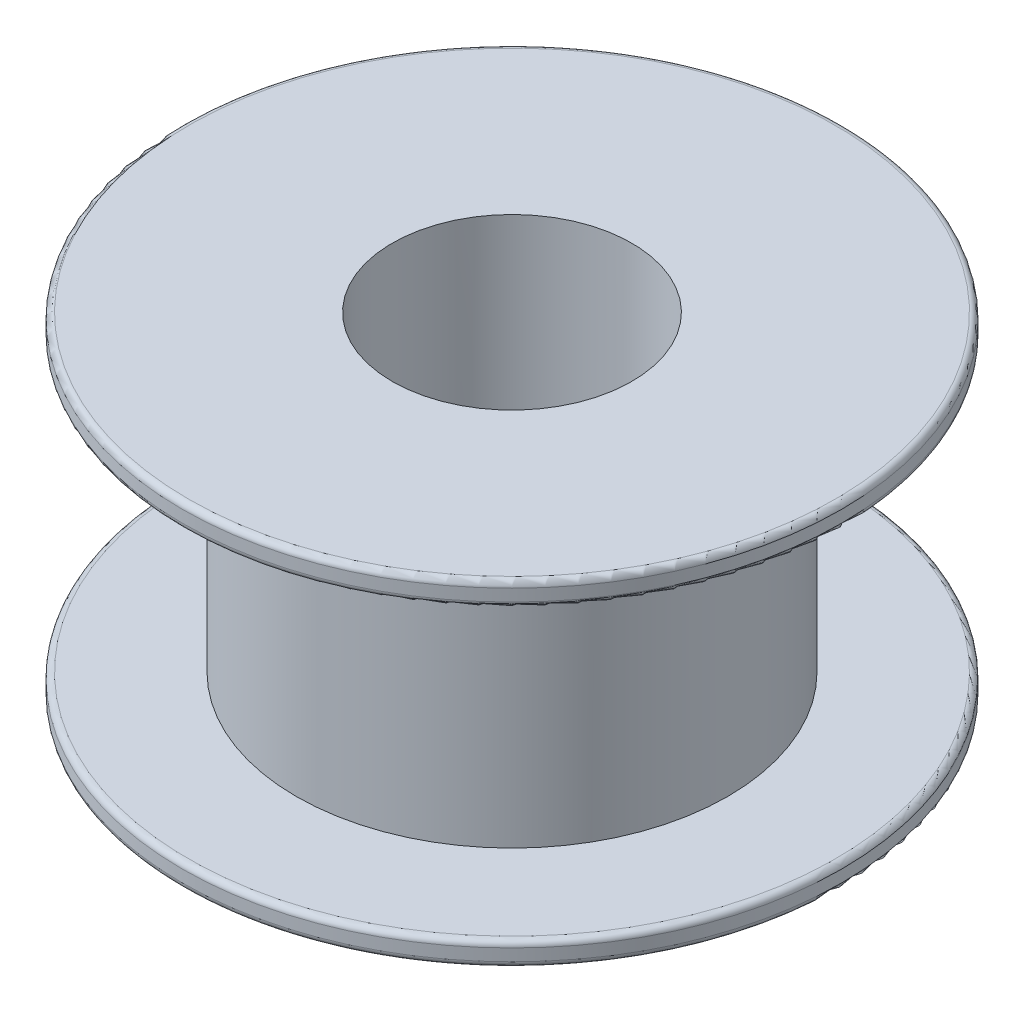
ISO-10303-21;
HEADER;
FILE_DESCRIPTION(('STEP AP214'),'2;1');
FILE_NAME('part.step','',(''),(''),'','','');
FILE_SCHEMA(('AUTOMOTIVE_DESIGN { 1 0 10303 214 1 1 1 1 }'));
ENDSEC;
DATA;
#1=APPLICATION_CONTEXT('core data for automotive mechanical design processes');
#2=APPLICATION_PROTOCOL_DEFINITION('international standard','automotive_design',2000,#1);
#3=PRODUCT_CONTEXT('',#1,'mechanical');
#4=PRODUCT('Part','Part','',(#3));
#5=PRODUCT_RELATED_PRODUCT_CATEGORY('part','',(#4));
#6=PRODUCT_DEFINITION_FORMATION('','',#4);
#7=PRODUCT_DEFINITION_CONTEXT('part definition',#1,'design');
#8=PRODUCT_DEFINITION('design','',#6,#7);
#9=PRODUCT_DEFINITION_SHAPE('','',#8);
#10=(LENGTH_UNIT() NAMED_UNIT(*) SI_UNIT(.MILLI.,.METRE.));
#11=(NAMED_UNIT(*) PLANE_ANGLE_UNIT() SI_UNIT($,.RADIAN.));
#12=(NAMED_UNIT(*) SI_UNIT($,.STERADIAN.) SOLID_ANGLE_UNIT());
#13=UNCERTAINTY_MEASURE_WITH_UNIT(LENGTH_MEASURE(1.E-05),#10,'distance_accuracy_value','');
#14=(GEOMETRIC_REPRESENTATION_CONTEXT(3) GLOBAL_UNCERTAINTY_ASSIGNED_CONTEXT((#13)) GLOBAL_UNIT_ASSIGNED_CONTEXT((#10,
#11,#12)) REPRESENTATION_CONTEXT('',''));
#15=CARTESIAN_POINT('',(0.,0.,0.));
#16=DIRECTION('',(0.,0.,1.));
#17=DIRECTION('',(1.,0.,0.));
#18=AXIS2_PLACEMENT_3D('',#15,#16,#17);
#19=CARTESIAN_POINT('',(0.,-2.,0.));
#20=DIRECTION('',(0.,1.,0.));
#21=DIRECTION('',(0.,0.,1.));
#22=AXIS2_PLACEMENT_3D('',#19,#20,#21);
#23=PLANE('',#22);
#24=CARTESIAN_POINT('',(0.,-2.,0.));
#25=DIRECTION('',(0.,1.,0.));
#26=DIRECTION('',(0.,0.,1.));
#27=AXIS2_PLACEMENT_3D('',#24,#25,#26);
#28=CIRCLE('',#27,27.);
#29=CARTESIAN_POINT('',(0.,-2.,27.));
#30=VERTEX_POINT('',#29);
#31=EDGE_CURVE('E60',#30,#30,#28,.F.);
#32=ORIENTED_EDGE('',*,*,#31,.T.);
#33=EDGE_LOOP('',(#32));
#34=FACE_BOUND('',#33,.T.);
#35=CARTESIAN_POINT('',(0.,-2.,0.));
#36=DIRECTION('',(0.,1.,0.));
#37=DIRECTION('',(0.,0.,1.));
#38=AXIS2_PLACEMENT_3D('',#35,#36,#37);
#39=CIRCLE('',#38,18.);
#40=CARTESIAN_POINT('',(0.,-2.,18.));
#41=VERTEX_POINT('',#40);
#42=EDGE_CURVE('E69',#41,#41,#39,.F.);
#43=ORIENTED_EDGE('',*,*,#42,.F.);
#44=EDGE_LOOP('',(#43));
#45=FACE_BOUND('',#44,.T.);
#46=ADVANCED_FACE('F37',(#34,#45),#23,.F.);
#47=CARTESIAN_POINT('',(0.,-2.,0.));
#48=DIRECTION('',(0.,1.,0.));
#49=DIRECTION('',(0.,0.,1.));
#50=AXIS2_PLACEMENT_3D('',#47,#48,#49);
#51=CYLINDRICAL_SURFACE('',#50,27.5);
#52=CARTESIAN_POINT('',(0.,-1.5,0.));
#53=DIRECTION('',(0.,1.,0.));
#54=DIRECTION('',(0.,0.,1.));
#55=AXIS2_PLACEMENT_3D('',#52,#53,#54);
#56=CIRCLE('',#55,27.5);
#57=CARTESIAN_POINT('',(0.,-1.5,27.5));
#58=VERTEX_POINT('',#57);
#59=EDGE_CURVE('E63',#58,#58,#56,.T.);
#60=ORIENTED_EDGE('',*,*,#59,.T.);
#61=EDGE_LOOP('',(#60));
#62=FACE_BOUND('',#61,.T.);
#63=CARTESIAN_POINT('',(0.,-0.5,0.));
#64=DIRECTION('',(0.,1.,0.));
#65=DIRECTION('',(0.,0.,1.));
#66=AXIS2_PLACEMENT_3D('',#63,#64,#65);
#67=CIRCLE('',#66,27.5);
#68=CARTESIAN_POINT('',(0.,-0.5,27.5));
#69=VERTEX_POINT('',#68);
#70=EDGE_CURVE('E66',#69,#69,#67,.F.);
#71=ORIENTED_EDGE('',*,*,#70,.T.);
#72=EDGE_LOOP('',(#71));
#73=FACE_BOUND('',#72,.T.);
#74=ADVANCED_FACE('F98',(#62,#73),#51,.T.);
#75=CARTESIAN_POINT('',(0.,0.,0.));
#76=DIRECTION('',(0.,1.,0.));
#77=DIRECTION('',(0.,0.,1.));
#78=AXIS2_PLACEMENT_3D('',#75,#76,#77);
#79=PLANE('',#78);
#80=CARTESIAN_POINT('',(0.,0.,0.));
#81=DIRECTION('',(0.,1.,0.));
#82=DIRECTION('',(0.,0.,1.));
#83=AXIS2_PLACEMENT_3D('',#80,#81,#82);
#84=CIRCLE('',#83,27.);
#85=CARTESIAN_POINT('',(0.,0.,27.));
#86=VERTEX_POINT('',#85);
#87=EDGE_CURVE('E57',#86,#86,#84,.T.);
#88=ORIENTED_EDGE('',*,*,#87,.T.);
#89=EDGE_LOOP('',(#88));
#90=FACE_BOUND('',#89,.T.);
#91=CARTESIAN_POINT('',(0.,0.,0.));
#92=DIRECTION('',(0.,1.,0.));
#93=DIRECTION('',(0.,0.,1.));
#94=AXIS2_PLACEMENT_3D('',#91,#92,#93);
#95=CIRCLE('',#94,10.);
#96=CARTESIAN_POINT('',(0.,0.,10.));
#97=VERTEX_POINT('',#96);
#98=EDGE_CURVE('E72',#97,#97,#95,.T.);
#99=ORIENTED_EDGE('',*,*,#98,.F.);
#100=EDGE_LOOP('',(#99));
#101=FACE_BOUND('',#100,.T.);
#102=ADVANCED_FACE('F104',(#90,#101),#79,.T.);
#103=CARTESIAN_POINT('',(0.,-2.,0.));
#104=DIRECTION('',(0.,1.,0.));
#105=DIRECTION('',(0.,0.,1.));
#106=AXIS2_PLACEMENT_3D('',#103,#104,#105);
#107=CYLINDRICAL_SURFACE('',#106,10.);
#108=ORIENTED_EDGE('',*,*,#98,.T.);
#109=EDGE_LOOP('',(#108));
#110=FACE_BOUND('',#109,.T.);
#111=CARTESIAN_POINT('',(0.,-28.,0.));
#112=DIRECTION('',(0.,-1.,0.));
#113=DIRECTION('',(0.,0.,-1.));
#114=AXIS2_PLACEMENT_3D('',#111,#112,#113);
#115=CIRCLE('',#114,10.);
#116=CARTESIAN_POINT('',(0.,-28.,-10.));
#117=VERTEX_POINT('',#116);
#118=EDGE_CURVE('E78',#117,#117,#115,.T.);
#119=ORIENTED_EDGE('',*,*,#118,.T.);
#120=EDGE_LOOP('',(#119));
#121=FACE_BOUND('',#120,.T.);
#122=ADVANCED_FACE('F82',(#110,#121),#107,.F.);
#123=CARTESIAN_POINT('',(0.,-26.,0.));
#124=DIRECTION('',(0.,1.,0.));
#125=DIRECTION('',(0.,0.,1.));
#126=AXIS2_PLACEMENT_3D('',#123,#124,#125);
#127=CYLINDRICAL_SURFACE('',#126,18.);
#128=CARTESIAN_POINT('',(0.,-26.,0.));
#129=DIRECTION('',(0.,-1.,0.));
#130=DIRECTION('',(0.,0.,-1.));
#131=AXIS2_PLACEMENT_3D('',#128,#129,#130);
#132=CIRCLE('',#131,18.);
#133=CARTESIAN_POINT('',(0.,-26.,-18.));
#134=VERTEX_POINT('',#133);
#135=EDGE_CURVE('E75',#134,#134,#132,.T.);
#136=ORIENTED_EDGE('',*,*,#135,.F.);
#137=EDGE_LOOP('',(#136));
#138=FACE_BOUND('',#137,.T.);
#139=ORIENTED_EDGE('',*,*,#42,.T.);
#140=EDGE_LOOP('',(#139));
#141=FACE_BOUND('',#140,.T.);
#142=ADVANCED_FACE('F87',(#138,#141),#127,.T.);
#143=CARTESIAN_POINT('',(0.,-28.,0.));
#144=DIRECTION('',(0.,-1.,0.));
#145=DIRECTION('',(0.,0.,-1.));
#146=AXIS2_PLACEMENT_3D('',#143,#144,#145);
#147=PLANE('',#146);
#148=CARTESIAN_POINT('',(0.,-28.,0.));
#149=DIRECTION('',(0.,-1.,0.));
#150=DIRECTION('',(0.,0.,-1.));
#151=AXIS2_PLACEMENT_3D('',#148,#149,#150);
#152=CIRCLE('',#151,27.);
#153=CARTESIAN_POINT('',(0.,-28.,-27.));
#154=VERTEX_POINT('',#153);
#155=EDGE_CURVE('E10',#154,#154,#152,.T.);
#156=ORIENTED_EDGE('',*,*,#155,.T.);
#157=EDGE_LOOP('',(#156));
#158=FACE_BOUND('',#157,.T.);
#159=ORIENTED_EDGE('',*,*,#118,.F.);
#160=EDGE_LOOP('',(#159));
#161=FACE_BOUND('',#160,.T.);
#162=ADVANCED_FACE('F84',(#158,#161),#147,.T.);
#163=CARTESIAN_POINT('',(0.,-26.,0.));
#164=DIRECTION('',(0.,-1.,0.));
#165=DIRECTION('',(0.,0.,-1.));
#166=AXIS2_PLACEMENT_3D('',#163,#164,#165);
#167=PLANE('',#166);
#168=CARTESIAN_POINT('',(0.,-26.,0.));
#169=DIRECTION('',(0.,-1.,0.));
#170=DIRECTION('',(0.,0.,-1.));
#171=AXIS2_PLACEMENT_3D('',#168,#169,#170);
#172=CIRCLE('',#171,27.);
#173=CARTESIAN_POINT('',(0.,-26.,-27.));
#174=VERTEX_POINT('',#173);
#175=EDGE_CURVE('E44',#174,#174,#172,.F.);
#176=ORIENTED_EDGE('',*,*,#175,.T.);
#177=EDGE_LOOP('',(#176));
#178=FACE_BOUND('',#177,.T.);
#179=ORIENTED_EDGE('',*,*,#135,.T.);
#180=EDGE_LOOP('',(#179));
#181=FACE_BOUND('',#180,.T.);
#182=ADVANCED_FACE('F86',(#178,#181),#167,.F.);
#183=CARTESIAN_POINT('',(0.,-28.,0.));
#184=DIRECTION('',(0.,1.,0.));
#185=DIRECTION('',(0.,0.,1.));
#186=AXIS2_PLACEMENT_3D('',#183,#184,#185);
#187=CYLINDRICAL_SURFACE('',#186,27.5);
#188=CARTESIAN_POINT('',(0.,-26.5,0.));
#189=DIRECTION('',(0.,-1.,0.));
#190=DIRECTION('',(0.,0.,-1.));
#191=AXIS2_PLACEMENT_3D('',#188,#189,#190);
#192=CIRCLE('',#191,27.5);
#193=CARTESIAN_POINT('',(0.,-26.5,-27.5));
#194=VERTEX_POINT('',#193);
#195=EDGE_CURVE('E48',#194,#194,#192,.T.);
#196=ORIENTED_EDGE('',*,*,#195,.T.);
#197=EDGE_LOOP('',(#196));
#198=FACE_BOUND('',#197,.T.);
#199=CARTESIAN_POINT('',(0.,-27.5,0.));
#200=DIRECTION('',(0.,-1.,0.));
#201=DIRECTION('',(0.,0.,-1.));
#202=AXIS2_PLACEMENT_3D('',#199,#200,#201);
#203=CIRCLE('',#202,27.5);
#204=CARTESIAN_POINT('',(0.,-27.5,-27.5));
#205=VERTEX_POINT('',#204);
#206=EDGE_CURVE('E52',#205,#205,#203,.F.);
#207=ORIENTED_EDGE('',*,*,#206,.T.);
#208=EDGE_LOOP('',(#207));
#209=FACE_BOUND('',#208,.T.);
#210=ADVANCED_FACE('F93',(#198,#209),#187,.T.);
#211=CARTESIAN_POINT('',(0.,-1.5,0.));
#212=DIRECTION('',(0.,1.,0.));
#213=DIRECTION('',(0.,0.,1.));
#214=AXIS2_PLACEMENT_3D('',#211,#212,#213);
#215=TOROIDAL_SURFACE('',#214,27.,0.5);
#216=ORIENTED_EDGE('',*,*,#31,.F.);
#217=EDGE_LOOP('',(#216));
#218=FACE_BOUND('',#217,.T.);
#219=ORIENTED_EDGE('',*,*,#59,.F.);
#220=EDGE_LOOP('',(#219));
#221=FACE_BOUND('',#220,.T.);
#222=ADVANCED_FACE('F113',(#218,#221),#215,.T.);
#223=CARTESIAN_POINT('',(0.,-0.5,0.));
#224=DIRECTION('',(0.,1.,0.));
#225=DIRECTION('',(0.,0.,1.));
#226=AXIS2_PLACEMENT_3D('',#223,#224,#225);
#227=TOROIDAL_SURFACE('',#226,27.,0.5);
#228=ORIENTED_EDGE('',*,*,#70,.F.);
#229=EDGE_LOOP('',(#228));
#230=FACE_BOUND('',#229,.T.);
#231=ORIENTED_EDGE('',*,*,#87,.F.);
#232=EDGE_LOOP('',(#231));
#233=FACE_BOUND('',#232,.T.);
#234=ADVANCED_FACE('F116',(#230,#233),#227,.T.);
#235=CARTESIAN_POINT('',(0.,-26.5,0.));
#236=DIRECTION('',(0.,-1.,0.));
#237=DIRECTION('',(0.,0.,-1.));
#238=AXIS2_PLACEMENT_3D('',#235,#236,#237);
#239=TOROIDAL_SURFACE('',#238,27.,0.5);
#240=ORIENTED_EDGE('',*,*,#175,.F.);
#241=EDGE_LOOP('',(#240));
#242=FACE_BOUND('',#241,.T.);
#243=ORIENTED_EDGE('',*,*,#195,.F.);
#244=EDGE_LOOP('',(#243));
#245=FACE_BOUND('',#244,.T.);
#246=ADVANCED_FACE('F119',(#242,#245),#239,.T.);
#247=CARTESIAN_POINT('',(0.,-27.5,0.));
#248=DIRECTION('',(0.,-1.,0.));
#249=DIRECTION('',(0.,0.,-1.));
#250=AXIS2_PLACEMENT_3D('',#247,#248,#249);
#251=TOROIDAL_SURFACE('',#250,27.,0.5);
#252=ORIENTED_EDGE('',*,*,#206,.F.);
#253=EDGE_LOOP('',(#252));
#254=FACE_BOUND('',#253,.T.);
#255=ORIENTED_EDGE('',*,*,#155,.F.);
#256=EDGE_LOOP('',(#255));
#257=FACE_BOUND('',#256,.T.);
#258=ADVANCED_FACE('F39',(#254,#257),#251,.T.);
#259=CLOSED_SHELL('',(#46,#74,#102,#122,#142,#162,#182,#210,#222,#234,#246,#258));
#260=MANIFOLD_SOLID_BREP('B2',#259);
#261=ADVANCED_BREP_SHAPE_REPRESENTATION('',(#18,#260),#14);
#262=SHAPE_DEFINITION_REPRESENTATION(#9,#261);
ENDSEC;
END-ISO-10303-21;
